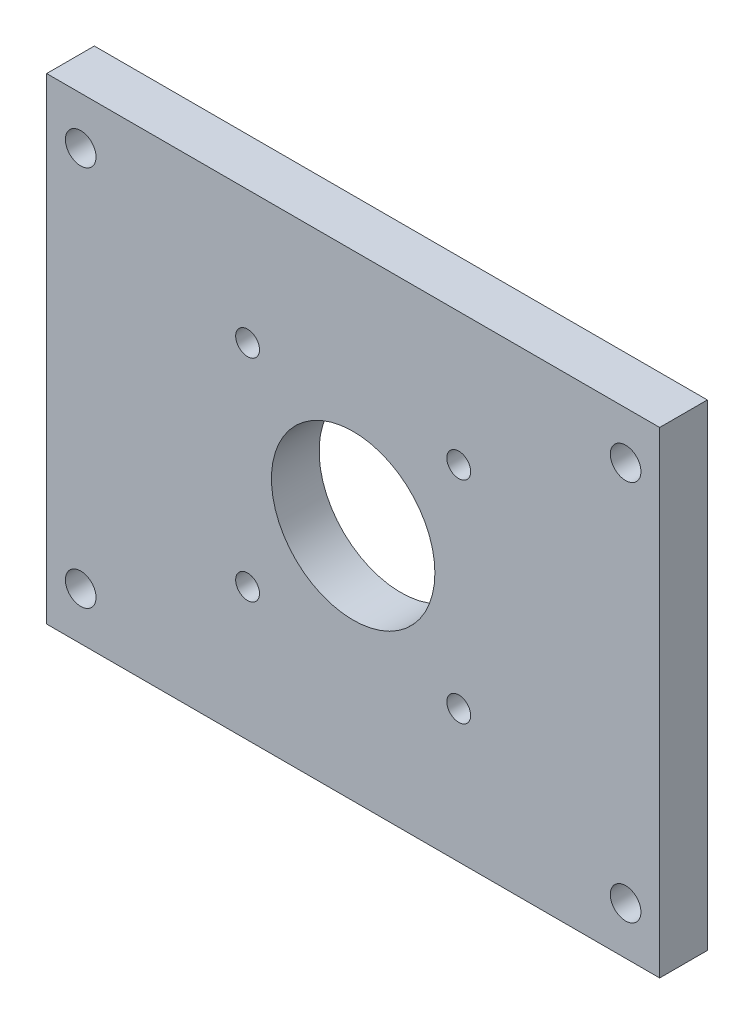
ISO-10303-21;
HEADER;
FILE_DESCRIPTION(('STEP AP214'),'2;1');
FILE_NAME('part.step','',(''),(''),'','','');
FILE_SCHEMA(('AUTOMOTIVE_DESIGN { 1 0 10303 214 1 1 1 1 }'));
ENDSEC;
DATA;
#1=APPLICATION_CONTEXT('core data for automotive mechanical design processes');
#2=APPLICATION_PROTOCOL_DEFINITION('international standard','automotive_design',2000,#1);
#3=PRODUCT_CONTEXT('',#1,'mechanical');
#4=PRODUCT('Part','Part','',(#3));
#5=PRODUCT_RELATED_PRODUCT_CATEGORY('part','',(#4));
#6=PRODUCT_DEFINITION_FORMATION('','',#4);
#7=PRODUCT_DEFINITION_CONTEXT('part definition',#1,'design');
#8=PRODUCT_DEFINITION('design','',#6,#7);
#9=PRODUCT_DEFINITION_SHAPE('','',#8);
#10=(LENGTH_UNIT() NAMED_UNIT(*) SI_UNIT(.MILLI.,.METRE.));
#11=(NAMED_UNIT(*) PLANE_ANGLE_UNIT() SI_UNIT($,.RADIAN.));
#12=(NAMED_UNIT(*) SI_UNIT($,.STERADIAN.) SOLID_ANGLE_UNIT());
#13=UNCERTAINTY_MEASURE_WITH_UNIT(LENGTH_MEASURE(1.E-05),#10,'distance_accuracy_value','');
#14=(GEOMETRIC_REPRESENTATION_CONTEXT(3) GLOBAL_UNCERTAINTY_ASSIGNED_CONTEXT((#13)) GLOBAL_UNIT_ASSIGNED_CONTEXT((#10,
#11,#12)) REPRESENTATION_CONTEXT('',''));
#15=CARTESIAN_POINT('',(0.,0.,0.));
#16=DIRECTION('',(0.,0.,1.));
#17=DIRECTION('',(1.,0.,0.));
#18=AXIS2_PLACEMENT_3D('',#15,#16,#17);
#19=CARTESIAN_POINT('',(0.,0.,0.00839999999971));
#20=DIRECTION('',(0.,0.,1.));
#21=DIRECTION('',(1.,0.,0.));
#22=AXIS2_PLACEMENT_3D('',#19,#20,#21);
#23=PLANE('',#22);
#24=CARTESIAN_POINT('',(85.,63.,0.008399999999938));
#25=DIRECTION('',(0.,0.,1.));
#26=DIRECTION('',(1.,0.,0.));
#27=AXIS2_PLACEMENT_3D('',#24,#25,#26);
#28=CIRCLE('',#27,2.25);
#29=CARTESIAN_POINT('',(87.25,63.,0.008399999999938));
#30=VERTEX_POINT('',#29);
#31=EDGE_CURVE('E105',#30,#30,#28,.T.);
#32=ORIENTED_EDGE('',*,*,#31,.T.);
#33=EDGE_LOOP('',(#32));
#34=FACE_BOUND('',#33,.T.);
#35=CARTESIAN_POINT('',(60.5,50.5,0.008399999999938));
#36=DIRECTION('',(0.,0.,1.));
#37=DIRECTION('',(1.,0.,0.));
#38=AXIS2_PLACEMENT_3D('',#35,#36,#37);
#39=CIRCLE('',#38,1.75);
#40=CARTESIAN_POINT('',(62.25,50.5,0.008399999999938));
#41=VERTEX_POINT('',#40);
#42=EDGE_CURVE('E109',#41,#41,#39,.T.);
#43=ORIENTED_EDGE('',*,*,#42,.T.);
#44=EDGE_LOOP('',(#43));
#45=FACE_BOUND('',#44,.T.);
#46=CARTESIAN_POINT('',(45.,35.,0.008399999999938));
#47=DIRECTION('',(0.,0.,1.));
#48=DIRECTION('',(1.,0.,0.));
#49=AXIS2_PLACEMENT_3D('',#46,#47,#48);
#50=CIRCLE('',#49,12.);
#51=CARTESIAN_POINT('',(57.,35.,0.008399999999938));
#52=VERTEX_POINT('',#51);
#53=EDGE_CURVE('E112',#52,#52,#50,.T.);
#54=ORIENTED_EDGE('',*,*,#53,.T.);
#55=EDGE_LOOP('',(#54));
#56=FACE_BOUND('',#55,.T.);
#57=CARTESIAN_POINT('',(29.5,50.5,0.008399999999938));
#58=DIRECTION('',(0.,0.,1.));
#59=DIRECTION('',(1.,0.,0.));
#60=AXIS2_PLACEMENT_3D('',#57,#58,#59);
#61=CIRCLE('',#60,1.75);
#62=CARTESIAN_POINT('',(31.25,50.5,0.008399999999938));
#63=VERTEX_POINT('',#62);
#64=EDGE_CURVE('E115',#63,#63,#61,.T.);
#65=ORIENTED_EDGE('',*,*,#64,.T.);
#66=EDGE_LOOP('',(#65));
#67=FACE_BOUND('',#66,.T.);
#68=CARTESIAN_POINT('',(5.,63.,0.008399999999938));
#69=DIRECTION('',(0.,0.,1.));
#70=DIRECTION('',(1.,0.,0.));
#71=AXIS2_PLACEMENT_3D('',#68,#69,#70);
#72=CIRCLE('',#71,2.25);
#73=CARTESIAN_POINT('',(7.25,63.,0.008399999999938));
#74=VERTEX_POINT('',#73);
#75=EDGE_CURVE('E118',#74,#74,#72,.T.);
#76=ORIENTED_EDGE('',*,*,#75,.T.);
#77=EDGE_LOOP('',(#76));
#78=FACE_BOUND('',#77,.T.);
#79=CARTESIAN_POINT('',(85.,7.,0.008399999999938));
#80=DIRECTION('',(0.,0.,1.));
#81=DIRECTION('',(1.,0.,0.));
#82=AXIS2_PLACEMENT_3D('',#79,#80,#81);
#83=CIRCLE('',#82,2.25);
#84=CARTESIAN_POINT('',(87.25,7.,0.008399999999938));
#85=VERTEX_POINT('',#84);
#86=EDGE_CURVE('E121',#85,#85,#83,.T.);
#87=ORIENTED_EDGE('',*,*,#86,.T.);
#88=EDGE_LOOP('',(#87));
#89=FACE_BOUND('',#88,.T.);
#90=CARTESIAN_POINT('',(60.5,19.5,0.008399999999938));
#91=DIRECTION('',(0.,0.,1.));
#92=DIRECTION('',(1.,0.,0.));
#93=AXIS2_PLACEMENT_3D('',#90,#91,#92);
#94=CIRCLE('',#93,1.75);
#95=CARTESIAN_POINT('',(62.25,19.5,0.008399999999938));
#96=VERTEX_POINT('',#95);
#97=EDGE_CURVE('E124',#96,#96,#94,.T.);
#98=ORIENTED_EDGE('',*,*,#97,.T.);
#99=EDGE_LOOP('',(#98));
#100=FACE_BOUND('',#99,.T.);
#101=CARTESIAN_POINT('',(29.5,19.5,0.008399999999938));
#102=DIRECTION('',(0.,0.,1.));
#103=DIRECTION('',(1.,0.,0.));
#104=AXIS2_PLACEMENT_3D('',#101,#102,#103);
#105=CIRCLE('',#104,1.75);
#106=CARTESIAN_POINT('',(31.25,19.5,0.008399999999938));
#107=VERTEX_POINT('',#106);
#108=EDGE_CURVE('E126',#107,#107,#105,.T.);
#109=ORIENTED_EDGE('',*,*,#108,.T.);
#110=EDGE_LOOP('',(#109));
#111=FACE_BOUND('',#110,.T.);
#112=CARTESIAN_POINT('',(5.,7.,0.008399999999938));
#113=DIRECTION('',(0.,0.,1.));
#114=DIRECTION('',(1.,0.,0.));
#115=AXIS2_PLACEMENT_3D('',#112,#113,#114);
#116=CIRCLE('',#115,2.25);
#117=CARTESIAN_POINT('',(7.25,7.,0.008399999999938));
#118=VERTEX_POINT('',#117);
#119=EDGE_CURVE('E19',#118,#118,#116,.T.);
#120=ORIENTED_EDGE('',*,*,#119,.T.);
#121=EDGE_LOOP('',(#120));
#122=FACE_BOUND('',#121,.T.);
#123=DIRECTION('',(0.,1.,0.));
#124=VECTOR('',#123,1.);
#125=CARTESIAN_POINT('',(90.,0.,0.008399999999938));
#126=LINE('',#125,#124);
#127=CARTESIAN_POINT('',(90.,0.,0.008399999999881));
#128=VERTEX_POINT('',#127);
#129=CARTESIAN_POINT('',(90.,70.,0.008399999999824));
#130=VERTEX_POINT('',#129);
#131=EDGE_CURVE('E61',#128,#130,#126,.T.);
#132=ORIENTED_EDGE('',*,*,#131,.F.);
#133=DIRECTION('',(1.,0.,0.));
#134=VECTOR('',#133,1.);
#135=CARTESIAN_POINT('',(0.,0.,0.008399999999938));
#136=LINE('',#135,#134);
#137=CARTESIAN_POINT('',(0.,0.,0.008399999999824));
#138=VERTEX_POINT('',#137);
#139=EDGE_CURVE('E55',#128,#138,#136,.F.);
#140=ORIENTED_EDGE('',*,*,#139,.T.);
#141=DIRECTION('',(0.,1.,0.));
#142=VECTOR('',#141,1.);
#143=CARTESIAN_POINT('',(0.,0.,0.008399999999938));
#144=LINE('',#143,#142);
#145=CARTESIAN_POINT('',(0.,70.,0.008399999999824));
#146=VERTEX_POINT('',#145);
#147=EDGE_CURVE('E59',#138,#146,#144,.T.);
#148=ORIENTED_EDGE('',*,*,#147,.T.);
#149=DIRECTION('',(1.,0.,0.));
#150=VECTOR('',#149,1.);
#151=CARTESIAN_POINT('',(0.,70.,0.008399999999938));
#152=LINE('',#151,#150);
#153=EDGE_CURVE('E135',#130,#146,#152,.F.);
#154=ORIENTED_EDGE('',*,*,#153,.F.);
#155=EDGE_LOOP('',(#132,#140,#148,#154));
#156=FACE_BOUND('',#155,.T.);
#157=ADVANCED_FACE('F16',(#34,#45,#56,#67,#78,#89,#100,#111,#122,#156),#23,.F.);
#158=CARTESIAN_POINT('',(0.,0.,0.00839999999971));
#159=DIRECTION('',(1.,0.,0.));
#160=DIRECTION('',(0.,0.,-1.));
#161=AXIS2_PLACEMENT_3D('',#158,#159,#160);
#162=PLANE('',#161);
#163=DIRECTION('',(0.,0.,1.));
#164=VECTOR('',#163,1.);
#165=CARTESIAN_POINT('',(0.,70.,0.00839999999971));
#166=LINE('',#165,#164);
#167=CARTESIAN_POINT('',(0.,70.,7.0084));
#168=VERTEX_POINT('',#167);
#169=EDGE_CURVE('E69',#146,#168,#166,.T.);
#170=ORIENTED_EDGE('',*,*,#169,.F.);
#171=ORIENTED_EDGE('',*,*,#147,.F.);
#172=DIRECTION('',(0.,0.,1.));
#173=VECTOR('',#172,1.);
#174=CARTESIAN_POINT('',(0.,0.,0.00839999999971));
#175=LINE('',#174,#173);
#176=CARTESIAN_POINT('',(0.,0.,7.0084));
#177=VERTEX_POINT('',#176);
#178=EDGE_CURVE('E63',#138,#177,#175,.T.);
#179=ORIENTED_EDGE('',*,*,#178,.T.);
#180=DIRECTION('',(0.,1.,0.));
#181=VECTOR('',#180,1.);
#182=CARTESIAN_POINT('',(0.,0.,7.0084));
#183=LINE('',#182,#181);
#184=EDGE_CURVE('E108',#168,#177,#183,.F.);
#185=ORIENTED_EDGE('',*,*,#184,.F.);
#186=EDGE_LOOP('',(#170,#171,#179,#185));
#187=FACE_BOUND('',#186,.T.);
#188=ADVANCED_FACE('F66',(#187),#162,.F.);
#189=CARTESIAN_POINT('',(0.,0.,0.00839999999971));
#190=DIRECTION('',(0.,1.,0.));
#191=DIRECTION('',(0.,0.,1.));
#192=AXIS2_PLACEMENT_3D('',#189,#190,#191);
#193=PLANE('',#192);
#194=DIRECTION('',(1.,0.,0.));
#195=VECTOR('',#194,1.);
#196=CARTESIAN_POINT('',(0.,0.,7.0084));
#197=LINE('',#196,#195);
#198=CARTESIAN_POINT('',(90.,0.,7.0084));
#199=VERTEX_POINT('',#198);
#200=EDGE_CURVE('E74',#177,#199,#197,.T.);
#201=ORIENTED_EDGE('',*,*,#200,.F.);
#202=ORIENTED_EDGE('',*,*,#178,.F.);
#203=ORIENTED_EDGE('',*,*,#139,.F.);
#204=DIRECTION('',(0.,0.,-1.));
#205=VECTOR('',#204,1.);
#206=CARTESIAN_POINT('',(90.,0.,0.00839999999971));
#207=LINE('',#206,#205);
#208=EDGE_CURVE('E76',#199,#128,#207,.T.);
#209=ORIENTED_EDGE('',*,*,#208,.F.);
#210=EDGE_LOOP('',(#201,#202,#203,#209));
#211=FACE_BOUND('',#210,.T.);
#212=ADVANCED_FACE('F72',(#211),#193,.F.);
#213=CARTESIAN_POINT('',(90.,0.,0.00839999999971));
#214=DIRECTION('',(1.,0.,0.));
#215=DIRECTION('',(0.,0.,-1.));
#216=AXIS2_PLACEMENT_3D('',#213,#214,#215);
#217=PLANE('',#216);
#218=DIRECTION('',(0.,0.,1.));
#219=VECTOR('',#218,1.);
#220=CARTESIAN_POINT('',(90.,70.,0.00839999999971));
#221=LINE('',#220,#219);
#222=CARTESIAN_POINT('',(90.,70.,7.0084));
#223=VERTEX_POINT('',#222);
#224=EDGE_CURVE('E34',#223,#130,#221,.F.);
#225=ORIENTED_EDGE('',*,*,#224,.F.);
#226=DIRECTION('',(0.,1.,0.));
#227=VECTOR('',#226,1.);
#228=CARTESIAN_POINT('',(90.,0.,7.0084));
#229=LINE('',#228,#227);
#230=EDGE_CURVE('E142',#199,#223,#229,.T.);
#231=ORIENTED_EDGE('',*,*,#230,.F.);
#232=ORIENTED_EDGE('',*,*,#208,.T.);
#233=ORIENTED_EDGE('',*,*,#131,.T.);
#234=EDGE_LOOP('',(#225,#231,#232,#233));
#235=FACE_BOUND('',#234,.T.);
#236=ADVANCED_FACE('F140',(#235),#217,.T.);
#237=CARTESIAN_POINT('',(0.,70.,0.00839999999971));
#238=DIRECTION('',(0.,1.,0.));
#239=DIRECTION('',(0.,0.,1.));
#240=AXIS2_PLACEMENT_3D('',#237,#238,#239);
#241=PLANE('',#240);
#242=DIRECTION('',(1.,0.,0.));
#243=VECTOR('',#242,1.);
#244=CARTESIAN_POINT('',(0.,70.,7.0084));
#245=LINE('',#244,#243);
#246=EDGE_CURVE('E104',#223,#168,#245,.F.);
#247=ORIENTED_EDGE('',*,*,#246,.F.);
#248=ORIENTED_EDGE('',*,*,#224,.T.);
#249=ORIENTED_EDGE('',*,*,#153,.T.);
#250=ORIENTED_EDGE('',*,*,#169,.T.);
#251=EDGE_LOOP('',(#247,#248,#249,#250));
#252=FACE_BOUND('',#251,.T.);
#253=ADVANCED_FACE('F148',(#252),#241,.T.);
#254=CARTESIAN_POINT('',(5.,7.,0.00839999999971));
#255=DIRECTION('',(0.,0.,1.));
#256=DIRECTION('',(1.,0.,0.));
#257=AXIS2_PLACEMENT_3D('',#254,#255,#256);
#258=CYLINDRICAL_SURFACE('',#257,2.25);
#259=ORIENTED_EDGE('',*,*,#119,.F.);
#260=EDGE_LOOP('',(#259));
#261=FACE_BOUND('',#260,.T.);
#262=CARTESIAN_POINT('',(5.,7.,7.0084));
#263=DIRECTION('',(0.,0.,1.));
#264=DIRECTION('',(1.,0.,0.));
#265=AXIS2_PLACEMENT_3D('',#262,#263,#264);
#266=CIRCLE('',#265,2.25);
#267=CARTESIAN_POINT('',(7.25,7.,7.0084));
#268=VERTEX_POINT('',#267);
#269=EDGE_CURVE('E101',#268,#268,#266,.F.);
#270=ORIENTED_EDGE('',*,*,#269,.F.);
#271=EDGE_LOOP('',(#270));
#272=FACE_BOUND('',#271,.T.);
#273=ADVANCED_FACE('F150',(#261,#272),#258,.F.);
#274=CARTESIAN_POINT('',(29.5,19.5,0.00839999999971));
#275=DIRECTION('',(0.,0.,1.));
#276=DIRECTION('',(1.,0.,0.));
#277=AXIS2_PLACEMENT_3D('',#274,#275,#276);
#278=CYLINDRICAL_SURFACE('',#277,1.75);
#279=ORIENTED_EDGE('',*,*,#108,.F.);
#280=EDGE_LOOP('',(#279));
#281=FACE_BOUND('',#280,.T.);
#282=CARTESIAN_POINT('',(29.5,19.5,7.0084));
#283=DIRECTION('',(0.,0.,1.));
#284=DIRECTION('',(1.,0.,0.));
#285=AXIS2_PLACEMENT_3D('',#282,#283,#284);
#286=CIRCLE('',#285,1.75);
#287=CARTESIAN_POINT('',(31.25,19.5,7.0084));
#288=VERTEX_POINT('',#287);
#289=EDGE_CURVE('E98',#288,#288,#286,.F.);
#290=ORIENTED_EDGE('',*,*,#289,.F.);
#291=EDGE_LOOP('',(#290));
#292=FACE_BOUND('',#291,.T.);
#293=ADVANCED_FACE('F157',(#281,#292),#278,.F.);
#294=CARTESIAN_POINT('',(60.5,19.5,0.00839999999971));
#295=DIRECTION('',(0.,0.,1.));
#296=DIRECTION('',(1.,0.,0.));
#297=AXIS2_PLACEMENT_3D('',#294,#295,#296);
#298=CYLINDRICAL_SURFACE('',#297,1.75);
#299=ORIENTED_EDGE('',*,*,#97,.F.);
#300=EDGE_LOOP('',(#299));
#301=FACE_BOUND('',#300,.T.);
#302=CARTESIAN_POINT('',(60.5,19.5,7.0084));
#303=DIRECTION('',(0.,0.,1.));
#304=DIRECTION('',(1.,0.,0.));
#305=AXIS2_PLACEMENT_3D('',#302,#303,#304);
#306=CIRCLE('',#305,1.75);
#307=CARTESIAN_POINT('',(62.25,19.5,7.0084));
#308=VERTEX_POINT('',#307);
#309=EDGE_CURVE('E95',#308,#308,#306,.F.);
#310=ORIENTED_EDGE('',*,*,#309,.F.);
#311=EDGE_LOOP('',(#310));
#312=FACE_BOUND('',#311,.T.);
#313=ADVANCED_FACE('F191',(#301,#312),#298,.F.);
#314=CARTESIAN_POINT('',(85.,7.,0.00839999999971));
#315=DIRECTION('',(0.,0.,1.));
#316=DIRECTION('',(1.,0.,0.));
#317=AXIS2_PLACEMENT_3D('',#314,#315,#316);
#318=CYLINDRICAL_SURFACE('',#317,2.25);
#319=ORIENTED_EDGE('',*,*,#86,.F.);
#320=EDGE_LOOP('',(#319));
#321=FACE_BOUND('',#320,.T.);
#322=CARTESIAN_POINT('',(85.,7.,7.0084));
#323=DIRECTION('',(0.,0.,1.));
#324=DIRECTION('',(1.,0.,0.));
#325=AXIS2_PLACEMENT_3D('',#322,#323,#324);
#326=CIRCLE('',#325,2.25);
#327=CARTESIAN_POINT('',(87.25,7.,7.0084));
#328=VERTEX_POINT('',#327);
#329=EDGE_CURVE('E92',#328,#328,#326,.F.);
#330=ORIENTED_EDGE('',*,*,#329,.F.);
#331=EDGE_LOOP('',(#330));
#332=FACE_BOUND('',#331,.T.);
#333=ADVANCED_FACE('F187',(#321,#332),#318,.F.);
#334=CARTESIAN_POINT('',(5.,63.,0.00839999999971));
#335=DIRECTION('',(0.,0.,1.));
#336=DIRECTION('',(1.,0.,0.));
#337=AXIS2_PLACEMENT_3D('',#334,#335,#336);
#338=CYLINDRICAL_SURFACE('',#337,2.25);
#339=ORIENTED_EDGE('',*,*,#75,.F.);
#340=EDGE_LOOP('',(#339));
#341=FACE_BOUND('',#340,.T.);
#342=CARTESIAN_POINT('',(5.,63.,7.0084));
#343=DIRECTION('',(0.,0.,1.));
#344=DIRECTION('',(1.,0.,0.));
#345=AXIS2_PLACEMENT_3D('',#342,#343,#344);
#346=CIRCLE('',#345,2.25);
#347=CARTESIAN_POINT('',(7.25,63.,7.0084));
#348=VERTEX_POINT('',#347);
#349=EDGE_CURVE('E89',#348,#348,#346,.F.);
#350=ORIENTED_EDGE('',*,*,#349,.F.);
#351=EDGE_LOOP('',(#350));
#352=FACE_BOUND('',#351,.T.);
#353=ADVANCED_FACE('F183',(#341,#352),#338,.F.);
#354=CARTESIAN_POINT('',(29.5,50.5,0.00839999999971));
#355=DIRECTION('',(0.,0.,1.));
#356=DIRECTION('',(1.,0.,0.));
#357=AXIS2_PLACEMENT_3D('',#354,#355,#356);
#358=CYLINDRICAL_SURFACE('',#357,1.75);
#359=ORIENTED_EDGE('',*,*,#64,.F.);
#360=EDGE_LOOP('',(#359));
#361=FACE_BOUND('',#360,.T.);
#362=CARTESIAN_POINT('',(29.5,50.5,7.0084));
#363=DIRECTION('',(0.,0.,1.));
#364=DIRECTION('',(1.,0.,0.));
#365=AXIS2_PLACEMENT_3D('',#362,#363,#364);
#366=CIRCLE('',#365,1.75);
#367=CARTESIAN_POINT('',(31.25,50.5,7.0084));
#368=VERTEX_POINT('',#367);
#369=EDGE_CURVE('E86',#368,#368,#366,.F.);
#370=ORIENTED_EDGE('',*,*,#369,.F.);
#371=EDGE_LOOP('',(#370));
#372=FACE_BOUND('',#371,.T.);
#373=ADVANCED_FACE('F179',(#361,#372),#358,.F.);
#374=CARTESIAN_POINT('',(45.,35.,0.00839999999971));
#375=DIRECTION('',(0.,0.,1.));
#376=DIRECTION('',(1.,0.,0.));
#377=AXIS2_PLACEMENT_3D('',#374,#375,#376);
#378=CYLINDRICAL_SURFACE('',#377,12.);
#379=ORIENTED_EDGE('',*,*,#53,.F.);
#380=EDGE_LOOP('',(#379));
#381=FACE_BOUND('',#380,.T.);
#382=CARTESIAN_POINT('',(45.,35.,7.0084));
#383=DIRECTION('',(0.,0.,1.));
#384=DIRECTION('',(1.,0.,0.));
#385=AXIS2_PLACEMENT_3D('',#382,#383,#384);
#386=CIRCLE('',#385,12.);
#387=CARTESIAN_POINT('',(57.,35.,7.0084));
#388=VERTEX_POINT('',#387);
#389=EDGE_CURVE('E83',#388,#388,#386,.F.);
#390=ORIENTED_EDGE('',*,*,#389,.F.);
#391=EDGE_LOOP('',(#390));
#392=FACE_BOUND('',#391,.T.);
#393=ADVANCED_FACE('F175',(#381,#392),#378,.F.);
#394=CARTESIAN_POINT('',(60.5,50.5,0.00839999999971));
#395=DIRECTION('',(0.,0.,1.));
#396=DIRECTION('',(1.,0.,0.));
#397=AXIS2_PLACEMENT_3D('',#394,#395,#396);
#398=CYLINDRICAL_SURFACE('',#397,1.75);
#399=ORIENTED_EDGE('',*,*,#42,.F.);
#400=EDGE_LOOP('',(#399));
#401=FACE_BOUND('',#400,.T.);
#402=CARTESIAN_POINT('',(60.5,50.5,7.0084));
#403=DIRECTION('',(0.,0.,1.));
#404=DIRECTION('',(1.,0.,0.));
#405=AXIS2_PLACEMENT_3D('',#402,#403,#404);
#406=CIRCLE('',#405,1.75);
#407=CARTESIAN_POINT('',(62.25,50.5,7.0084));
#408=VERTEX_POINT('',#407);
#409=EDGE_CURVE('E25',#408,#408,#406,.F.);
#410=ORIENTED_EDGE('',*,*,#409,.F.);
#411=EDGE_LOOP('',(#410));
#412=FACE_BOUND('',#411,.T.);
#413=ADVANCED_FACE('F168',(#401,#412),#398,.F.);
#414=CARTESIAN_POINT('',(85.,63.,0.00839999999971));
#415=DIRECTION('',(0.,0.,1.));
#416=DIRECTION('',(1.,0.,0.));
#417=AXIS2_PLACEMENT_3D('',#414,#415,#416);
#418=CYLINDRICAL_SURFACE('',#417,2.25);
#419=ORIENTED_EDGE('',*,*,#31,.F.);
#420=EDGE_LOOP('',(#419));
#421=FACE_BOUND('',#420,.T.);
#422=CARTESIAN_POINT('',(85.,63.,7.0084));
#423=DIRECTION('',(0.,0.,1.));
#424=DIRECTION('',(1.,0.,0.));
#425=AXIS2_PLACEMENT_3D('',#422,#423,#424);
#426=CIRCLE('',#425,2.25);
#427=CARTESIAN_POINT('',(87.25,63.,7.0084));
#428=VERTEX_POINT('',#427);
#429=EDGE_CURVE('E11',#428,#428,#426,.F.);
#430=ORIENTED_EDGE('',*,*,#429,.F.);
#431=EDGE_LOOP('',(#430));
#432=FACE_BOUND('',#431,.T.);
#433=ADVANCED_FACE('F162',(#421,#432),#418,.F.);
#434=CARTESIAN_POINT('',(0.,0.,7.0084));
#435=DIRECTION('',(0.,0.,1.));
#436=DIRECTION('',(1.,0.,0.));
#437=AXIS2_PLACEMENT_3D('',#434,#435,#436);
#438=PLANE('',#437);
#439=ORIENTED_EDGE('',*,*,#429,.T.);
#440=EDGE_LOOP('',(#439));
#441=FACE_BOUND('',#440,.T.);
#442=ORIENTED_EDGE('',*,*,#409,.T.);
#443=EDGE_LOOP('',(#442));
#444=FACE_BOUND('',#443,.T.);
#445=ORIENTED_EDGE('',*,*,#389,.T.);
#446=EDGE_LOOP('',(#445));
#447=FACE_BOUND('',#446,.T.);
#448=ORIENTED_EDGE('',*,*,#369,.T.);
#449=EDGE_LOOP('',(#448));
#450=FACE_BOUND('',#449,.T.);
#451=ORIENTED_EDGE('',*,*,#349,.T.);
#452=EDGE_LOOP('',(#451));
#453=FACE_BOUND('',#452,.T.);
#454=ORIENTED_EDGE('',*,*,#329,.T.);
#455=EDGE_LOOP('',(#454));
#456=FACE_BOUND('',#455,.T.);
#457=ORIENTED_EDGE('',*,*,#309,.T.);
#458=EDGE_LOOP('',(#457));
#459=FACE_BOUND('',#458,.T.);
#460=ORIENTED_EDGE('',*,*,#289,.T.);
#461=EDGE_LOOP('',(#460));
#462=FACE_BOUND('',#461,.T.);
#463=ORIENTED_EDGE('',*,*,#269,.T.);
#464=EDGE_LOOP('',(#463));
#465=FACE_BOUND('',#464,.T.);
#466=ORIENTED_EDGE('',*,*,#230,.T.);
#467=ORIENTED_EDGE('',*,*,#246,.T.);
#468=ORIENTED_EDGE('',*,*,#184,.T.);
#469=ORIENTED_EDGE('',*,*,#200,.T.);
#470=EDGE_LOOP('',(#466,#467,#468,#469));
#471=FACE_BOUND('',#470,.T.);
#472=ADVANCED_FACE('F146',(#441,#444,#447,#450,#453,#456,#459,#462,#465,#471),#438,.T.);
#473=CLOSED_SHELL('',(#157,#188,#212,#236,#253,#273,#293,#313,#333,#353,#373,#393,#413,#433,#472));
#474=MANIFOLD_SOLID_BREP('B1',#473);
#475=ADVANCED_BREP_SHAPE_REPRESENTATION('',(#18,#474),#14);
#476=SHAPE_DEFINITION_REPRESENTATION(#9,#475);
ENDSEC;
END-ISO-10303-21;
